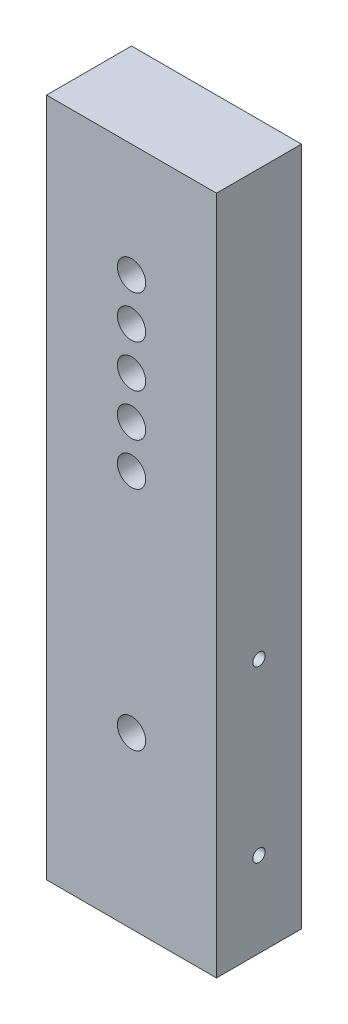
ISO-10303-21;
HEADER;
FILE_DESCRIPTION(('STEP AP214'),'2;1');
FILE_NAME('part.step','',(''),(''),'','','');
FILE_SCHEMA(('AUTOMOTIVE_DESIGN { 1 0 10303 214 1 1 1 1 }'));
ENDSEC;
DATA;
#1=APPLICATION_CONTEXT('core data for automotive mechanical design processes');
#2=APPLICATION_PROTOCOL_DEFINITION('international standard','automotive_design',2000,#1);
#3=PRODUCT_CONTEXT('',#1,'mechanical');
#4=PRODUCT('Part','Part','',(#3));
#5=PRODUCT_RELATED_PRODUCT_CATEGORY('part','',(#4));
#6=PRODUCT_DEFINITION_FORMATION('','',#4);
#7=PRODUCT_DEFINITION_CONTEXT('part definition',#1,'design');
#8=PRODUCT_DEFINITION('design','',#6,#7);
#9=PRODUCT_DEFINITION_SHAPE('','',#8);
#10=(LENGTH_UNIT() NAMED_UNIT(*) SI_UNIT(.MILLI.,.METRE.));
#11=(NAMED_UNIT(*) PLANE_ANGLE_UNIT() SI_UNIT($,.RADIAN.));
#12=(NAMED_UNIT(*) SI_UNIT($,.STERADIAN.) SOLID_ANGLE_UNIT());
#13=UNCERTAINTY_MEASURE_WITH_UNIT(LENGTH_MEASURE(1.E-05),#10,'distance_accuracy_value','');
#14=(GEOMETRIC_REPRESENTATION_CONTEXT(3) GLOBAL_UNCERTAINTY_ASSIGNED_CONTEXT((#13)) GLOBAL_UNIT_ASSIGNED_CONTEXT((#10,
#11,#12)) REPRESENTATION_CONTEXT('',''));
#15=CARTESIAN_POINT('',(0.,0.,0.));
#16=DIRECTION('',(0.,0.,1.));
#17=DIRECTION('',(1.,0.,0.));
#18=AXIS2_PLACEMENT_3D('',#15,#16,#17);
#19=CARTESIAN_POINT('',(50.927,114.3,412.75));
#20=DIRECTION('',(-1.,0.,0.));
#21=DIRECTION('',(0.,0.,1.));
#22=AXIS2_PLACEMENT_3D('',#19,#20,#21);
#23=PLANE('',#22);
#24=CARTESIAN_POINT('',(50.927,19.05,403.225));
#25=DIRECTION('',(-1.,0.,0.));
#26=DIRECTION('',(0.,0.,1.));
#27=AXIS2_PLACEMENT_3D('',#24,#25,#26);
#28=CIRCLE('',#27,1.38906250000009);
#29=CARTESIAN_POINT('',(50.927,19.05,404.6140625));
#30=VERTEX_POINT('',#29);
#31=EDGE_CURVE('E179',#30,#30,#28,.T.);
#32=ORIENTED_EDGE('',*,*,#31,.T.);
#33=EDGE_LOOP('',(#32));
#34=FACE_BOUND('',#33,.T.);
#35=CARTESIAN_POINT('',(50.927,-19.05,403.225));
#36=DIRECTION('',(-1.,0.,0.));
#37=DIRECTION('',(0.,0.,1.));
#38=AXIS2_PLACEMENT_3D('',#35,#36,#37);
#39=CIRCLE('',#38,1.38906250000009);
#40=CARTESIAN_POINT('',(50.927,-19.05,404.6140625));
#41=VERTEX_POINT('',#40);
#42=EDGE_CURVE('E173',#41,#41,#39,.T.);
#43=ORIENTED_EDGE('',*,*,#42,.T.);
#44=EDGE_LOOP('',(#43));
#45=FACE_BOUND('',#44,.T.);
#46=DIRECTION('',(0.,0.,-1.));
#47=VECTOR('',#46,1.);
#48=CARTESIAN_POINT('',(50.927,-38.1,412.75));
#49=LINE('',#48,#47);
#50=CARTESIAN_POINT('',(50.927,-38.1,412.75));
#51=VERTEX_POINT('',#50);
#52=CARTESIAN_POINT('',(50.927,-38.1,393.7));
#53=VERTEX_POINT('',#52);
#54=EDGE_CURVE('E109',#51,#53,#49,.T.);
#55=ORIENTED_EDGE('',*,*,#54,.T.);
#56=DIRECTION('',(0.,-1.,0.));
#57=VECTOR('',#56,1.);
#58=CARTESIAN_POINT('',(50.927,114.3,393.7));
#59=LINE('',#58,#57);
#60=CARTESIAN_POINT('',(50.927,114.3,393.7));
#61=VERTEX_POINT('',#60);
#62=EDGE_CURVE('E13',#61,#53,#59,.T.);
#63=ORIENTED_EDGE('',*,*,#62,.F.);
#64=DIRECTION('',(0.,0.,-1.));
#65=VECTOR('',#64,1.);
#66=CARTESIAN_POINT('',(50.927,114.3,412.75));
#67=LINE('',#66,#65);
#68=CARTESIAN_POINT('',(50.927,114.3,412.75));
#69=VERTEX_POINT('',#68);
#70=EDGE_CURVE('E97',#69,#61,#67,.T.);
#71=ORIENTED_EDGE('',*,*,#70,.F.);
#72=DIRECTION('',(0.,-1.,0.));
#73=VECTOR('',#72,1.);
#74=CARTESIAN_POINT('',(50.927,114.3,412.75));
#75=LINE('',#74,#73);
#76=EDGE_CURVE('E105',#69,#51,#75,.T.);
#77=ORIENTED_EDGE('',*,*,#76,.T.);
#78=EDGE_LOOP('',(#55,#63,#71,#77));
#79=FACE_BOUND('',#78,.T.);
#80=ADVANCED_FACE('F46',(#34,#45,#79),#23,.F.);
#81=CARTESIAN_POINT('',(50.927,114.3,393.7));
#82=DIRECTION('',(0.,0.,1.));
#83=DIRECTION('',(1.,0.,0.));
#84=AXIS2_PLACEMENT_3D('',#81,#82,#83);
#85=PLANE('',#84);
#86=CARTESIAN_POINT('',(31.877,79.375,393.7));
#87=DIRECTION('',(0.,0.,1.));
#88=DIRECTION('',(1.,0.,0.));
#89=AXIS2_PLACEMENT_3D('',#86,#87,#88);
#90=CIRCLE('',#89,3.175);
#91=CARTESIAN_POINT('',(35.052,79.375,393.7));
#92=VERTEX_POINT('',#91);
#93=EDGE_CURVE('E130',#92,#92,#90,.F.);
#94=ORIENTED_EDGE('',*,*,#93,.F.);
#95=EDGE_LOOP('',(#94));
#96=FACE_BOUND('',#95,.T.);
#97=CARTESIAN_POINT('',(31.877,69.85,393.7));
#98=DIRECTION('',(0.,0.,1.));
#99=DIRECTION('',(1.,0.,0.));
#100=AXIS2_PLACEMENT_3D('',#97,#98,#99);
#101=CIRCLE('',#100,3.175);
#102=CARTESIAN_POINT('',(35.052,69.85,393.7));
#103=VERTEX_POINT('',#102);
#104=EDGE_CURVE('E149',#103,#103,#101,.F.);
#105=ORIENTED_EDGE('',*,*,#104,.F.);
#106=EDGE_LOOP('',(#105));
#107=FACE_BOUND('',#106,.T.);
#108=CARTESIAN_POINT('',(31.877,60.325,393.7));
#109=DIRECTION('',(0.,0.,1.));
#110=DIRECTION('',(1.,0.,0.));
#111=AXIS2_PLACEMENT_3D('',#108,#109,#110);
#112=CIRCLE('',#111,3.175);
#113=CARTESIAN_POINT('',(35.052,60.325,393.7));
#114=VERTEX_POINT('',#113);
#115=EDGE_CURVE('E143',#114,#114,#112,.F.);
#116=ORIENTED_EDGE('',*,*,#115,.F.);
#117=EDGE_LOOP('',(#116));
#118=FACE_BOUND('',#117,.T.);
#119=CARTESIAN_POINT('',(31.877,50.8,393.7));
#120=DIRECTION('',(0.,0.,1.));
#121=DIRECTION('',(1.,0.,0.));
#122=AXIS2_PLACEMENT_3D('',#119,#120,#121);
#123=CIRCLE('',#122,3.175);
#124=CARTESIAN_POINT('',(35.052,50.8,393.7));
#125=VERTEX_POINT('',#124);
#126=EDGE_CURVE('E135',#125,#125,#123,.F.);
#127=ORIENTED_EDGE('',*,*,#126,.F.);
#128=EDGE_LOOP('',(#127));
#129=FACE_BOUND('',#128,.T.);
#130=CARTESIAN_POINT('',(31.877,0.,393.7));
#131=DIRECTION('',(0.,0.,1.));
#132=DIRECTION('',(1.,0.,0.));
#133=AXIS2_PLACEMENT_3D('',#130,#131,#132);
#134=CIRCLE('',#133,3.175);
#135=CARTESIAN_POINT('',(35.052,0.,393.7));
#136=VERTEX_POINT('',#135);
#137=EDGE_CURVE('E112',#136,#136,#134,.F.);
#138=ORIENTED_EDGE('',*,*,#137,.F.);
#139=EDGE_LOOP('',(#138));
#140=FACE_BOUND('',#139,.T.);
#141=CARTESIAN_POINT('',(31.877,88.9,393.7));
#142=DIRECTION('',(0.,0.,1.));
#143=DIRECTION('',(1.,0.,0.));
#144=AXIS2_PLACEMENT_3D('',#141,#142,#143);
#145=CIRCLE('',#144,3.175);
#146=CARTESIAN_POINT('',(35.052,88.9,393.7));
#147=VERTEX_POINT('',#146);
#148=EDGE_CURVE('E123',#147,#147,#145,.F.);
#149=ORIENTED_EDGE('',*,*,#148,.F.);
#150=EDGE_LOOP('',(#149));
#151=FACE_BOUND('',#150,.T.);
#152=DIRECTION('',(-1.,0.,0.));
#153=VECTOR('',#152,1.);
#154=CARTESIAN_POINT('',(50.927,-38.1,393.7));
#155=LINE('',#154,#153);
#156=CARTESIAN_POINT('',(12.827,-38.1,393.7));
#157=VERTEX_POINT('',#156);
#158=EDGE_CURVE('E101',#53,#157,#155,.T.);
#159=ORIENTED_EDGE('',*,*,#158,.T.);
#160=DIRECTION('',(0.,-1.,0.));
#161=VECTOR('',#160,1.);
#162=CARTESIAN_POINT('',(12.827,114.3,393.7));
#163=LINE('',#162,#161);
#164=CARTESIAN_POINT('',(12.827,114.3,393.7));
#165=VERTEX_POINT('',#164);
#166=EDGE_CURVE('E54',#165,#157,#163,.T.);
#167=ORIENTED_EDGE('',*,*,#166,.F.);
#168=DIRECTION('',(-1.,0.,0.));
#169=VECTOR('',#168,1.);
#170=CARTESIAN_POINT('',(50.927,114.3,393.7));
#171=LINE('',#170,#169);
#172=EDGE_CURVE('E92',#61,#165,#171,.T.);
#173=ORIENTED_EDGE('',*,*,#172,.F.);
#174=ORIENTED_EDGE('',*,*,#62,.T.);
#175=EDGE_LOOP('',(#159,#167,#173,#174));
#176=FACE_BOUND('',#175,.T.);
#177=ADVANCED_FACE('F100',(#96,#107,#118,#129,#140,#151,#176),#85,.F.);
#178=CARTESIAN_POINT('',(12.827,114.3,412.75));
#179=DIRECTION('',(1.,0.,0.));
#180=DIRECTION('',(0.,0.,-1.));
#181=AXIS2_PLACEMENT_3D('',#178,#179,#180);
#182=PLANE('',#181);
#183=CARTESIAN_POINT('',(12.827,-19.05,403.225));
#184=DIRECTION('',(-1.,0.,0.));
#185=DIRECTION('',(0.,0.,1.));
#186=AXIS2_PLACEMENT_3D('',#183,#184,#185);
#187=CIRCLE('',#186,1.38906250000009);
#188=CARTESIAN_POINT('',(12.827,-19.05,404.6140625));
#189=VERTEX_POINT('',#188);
#190=EDGE_CURVE('E166',#189,#189,#187,.T.);
#191=ORIENTED_EDGE('',*,*,#190,.F.);
#192=EDGE_LOOP('',(#191));
#193=FACE_BOUND('',#192,.T.);
#194=CARTESIAN_POINT('',(12.827,19.05,403.225));
#195=DIRECTION('',(-1.,0.,0.));
#196=DIRECTION('',(0.,0.,1.));
#197=AXIS2_PLACEMENT_3D('',#194,#195,#196);
#198=CIRCLE('',#197,1.38906250000009);
#199=CARTESIAN_POINT('',(12.827,19.05,404.6140625));
#200=VERTEX_POINT('',#199);
#201=EDGE_CURVE('E159',#200,#200,#198,.T.);
#202=ORIENTED_EDGE('',*,*,#201,.F.);
#203=EDGE_LOOP('',(#202));
#204=FACE_BOUND('',#203,.T.);
#205=DIRECTION('',(0.,0.,1.));
#206=VECTOR('',#205,1.);
#207=CARTESIAN_POINT('',(12.827,-38.1,412.75));
#208=LINE('',#207,#206);
#209=CARTESIAN_POINT('',(12.827,-38.1,412.75));
#210=VERTEX_POINT('',#209);
#211=EDGE_CURVE('E79',#157,#210,#208,.T.);
#212=ORIENTED_EDGE('',*,*,#211,.T.);
#213=DIRECTION('',(0.,-1.,0.));
#214=VECTOR('',#213,1.);
#215=CARTESIAN_POINT('',(12.827,114.3,412.75));
#216=LINE('',#215,#214);
#217=CARTESIAN_POINT('',(12.827,114.3,412.75));
#218=VERTEX_POINT('',#217);
#219=EDGE_CURVE('E102',#218,#210,#216,.T.);
#220=ORIENTED_EDGE('',*,*,#219,.F.);
#221=DIRECTION('',(0.,0.,1.));
#222=VECTOR('',#221,1.);
#223=CARTESIAN_POINT('',(12.827,114.3,412.75));
#224=LINE('',#223,#222);
#225=EDGE_CURVE('E95',#165,#218,#224,.T.);
#226=ORIENTED_EDGE('',*,*,#225,.F.);
#227=ORIENTED_EDGE('',*,*,#166,.T.);
#228=EDGE_LOOP('',(#212,#220,#226,#227));
#229=FACE_BOUND('',#228,.T.);
#230=ADVANCED_FACE('F103',(#193,#204,#229),#182,.F.);
#231=CARTESIAN_POINT('',(50.927,114.3,412.75));
#232=DIRECTION('',(0.,0.,-1.));
#233=DIRECTION('',(-1.,0.,0.));
#234=AXIS2_PLACEMENT_3D('',#231,#232,#233);
#235=PLANE('',#234);
#236=CARTESIAN_POINT('',(31.877,79.375,412.75));
#237=DIRECTION('',(0.,0.,1.));
#238=DIRECTION('',(1.,0.,0.));
#239=AXIS2_PLACEMENT_3D('',#236,#237,#238);
#240=CIRCLE('',#239,3.175);
#241=CARTESIAN_POINT('',(35.052,79.375,412.75));
#242=VERTEX_POINT('',#241);
#243=EDGE_CURVE('E152',#242,#242,#240,.T.);
#244=ORIENTED_EDGE('',*,*,#243,.F.);
#245=EDGE_LOOP('',(#244));
#246=FACE_BOUND('',#245,.T.);
#247=CARTESIAN_POINT('',(31.877,69.85,412.75));
#248=DIRECTION('',(0.,0.,1.));
#249=DIRECTION('',(1.,0.,0.));
#250=AXIS2_PLACEMENT_3D('',#247,#248,#249);
#251=CIRCLE('',#250,3.175);
#252=CARTESIAN_POINT('',(35.052,69.85,412.75));
#253=VERTEX_POINT('',#252);
#254=EDGE_CURVE('E146',#253,#253,#251,.T.);
#255=ORIENTED_EDGE('',*,*,#254,.F.);
#256=EDGE_LOOP('',(#255));
#257=FACE_BOUND('',#256,.T.);
#258=CARTESIAN_POINT('',(31.877,60.325,412.75));
#259=DIRECTION('',(0.,0.,1.));
#260=DIRECTION('',(1.,0.,0.));
#261=AXIS2_PLACEMENT_3D('',#258,#259,#260);
#262=CIRCLE('',#261,3.175);
#263=CARTESIAN_POINT('',(35.052,60.325,412.75));
#264=VERTEX_POINT('',#263);
#265=EDGE_CURVE('E138',#264,#264,#262,.T.);
#266=ORIENTED_EDGE('',*,*,#265,.F.);
#267=EDGE_LOOP('',(#266));
#268=FACE_BOUND('',#267,.T.);
#269=CARTESIAN_POINT('',(31.877,50.8,412.75));
#270=DIRECTION('',(0.,0.,1.));
#271=DIRECTION('',(1.,0.,0.));
#272=AXIS2_PLACEMENT_3D('',#269,#270,#271);
#273=CIRCLE('',#272,3.175);
#274=CARTESIAN_POINT('',(35.052,50.8,412.75));
#275=VERTEX_POINT('',#274);
#276=EDGE_CURVE('E139',#275,#275,#273,.T.);
#277=ORIENTED_EDGE('',*,*,#276,.F.);
#278=EDGE_LOOP('',(#277));
#279=FACE_BOUND('',#278,.T.);
#280=CARTESIAN_POINT('',(31.877,0.,412.75));
#281=DIRECTION('',(0.,0.,1.));
#282=DIRECTION('',(1.,0.,0.));
#283=AXIS2_PLACEMENT_3D('',#280,#281,#282);
#284=CIRCLE('',#283,3.175);
#285=CARTESIAN_POINT('',(35.052,0.,412.75));
#286=VERTEX_POINT('',#285);
#287=EDGE_CURVE('E126',#286,#286,#284,.T.);
#288=ORIENTED_EDGE('',*,*,#287,.F.);
#289=EDGE_LOOP('',(#288));
#290=FACE_BOUND('',#289,.T.);
#291=CARTESIAN_POINT('',(31.877,88.9,412.75));
#292=DIRECTION('',(0.,0.,1.));
#293=DIRECTION('',(1.,0.,0.));
#294=AXIS2_PLACEMENT_3D('',#291,#292,#293);
#295=CIRCLE('',#294,3.175);
#296=CARTESIAN_POINT('',(35.052,88.9,412.75));
#297=VERTEX_POINT('',#296);
#298=EDGE_CURVE('E127',#297,#297,#295,.T.);
#299=ORIENTED_EDGE('',*,*,#298,.F.);
#300=EDGE_LOOP('',(#299));
#301=FACE_BOUND('',#300,.T.);
#302=DIRECTION('',(1.,0.,0.));
#303=VECTOR('',#302,1.);
#304=CARTESIAN_POINT('',(50.927,-38.1,412.75));
#305=LINE('',#304,#303);
#306=EDGE_CURVE('E85',#210,#51,#305,.T.);
#307=ORIENTED_EDGE('',*,*,#306,.T.);
#308=ORIENTED_EDGE('',*,*,#76,.F.);
#309=DIRECTION('',(1.,0.,0.));
#310=VECTOR('',#309,1.);
#311=CARTESIAN_POINT('',(50.927,114.3,412.75));
#312=LINE('',#311,#310);
#313=EDGE_CURVE('E62',#218,#69,#312,.T.);
#314=ORIENTED_EDGE('',*,*,#313,.F.);
#315=ORIENTED_EDGE('',*,*,#219,.T.);
#316=EDGE_LOOP('',(#307,#308,#314,#315));
#317=FACE_BOUND('',#316,.T.);
#318=ADVANCED_FACE('F117',(#246,#257,#268,#279,#290,#301,#317),#235,.F.);
#319=CARTESIAN_POINT('',(0.,114.3,0.));
#320=DIRECTION('',(0.,1.,0.));
#321=DIRECTION('',(0.,0.,1.));
#322=AXIS2_PLACEMENT_3D('',#319,#320,#321);
#323=PLANE('',#322);
#324=ORIENTED_EDGE('',*,*,#70,.T.);
#325=ORIENTED_EDGE('',*,*,#172,.T.);
#326=ORIENTED_EDGE('',*,*,#225,.T.);
#327=ORIENTED_EDGE('',*,*,#313,.T.);
#328=EDGE_LOOP('',(#324,#325,#326,#327));
#329=FACE_BOUND('',#328,.T.);
#330=ADVANCED_FACE('F93',(#329),#323,.T.);
#331=CARTESIAN_POINT('',(0.,-38.1,0.));
#332=DIRECTION('',(0.,1.,0.));
#333=DIRECTION('',(0.,0.,1.));
#334=AXIS2_PLACEMENT_3D('',#331,#332,#333);
#335=PLANE('',#334);
#336=ORIENTED_EDGE('',*,*,#54,.F.);
#337=ORIENTED_EDGE('',*,*,#306,.F.);
#338=ORIENTED_EDGE('',*,*,#211,.F.);
#339=ORIENTED_EDGE('',*,*,#158,.F.);
#340=EDGE_LOOP('',(#336,#337,#338,#339));
#341=FACE_BOUND('',#340,.T.);
#342=ADVANCED_FACE('F120',(#341),#335,.F.);
#343=CARTESIAN_POINT('',(31.877,88.9,-127.001));
#344=DIRECTION('',(0.,0.,1.));
#345=DIRECTION('',(1.,0.,0.));
#346=AXIS2_PLACEMENT_3D('',#343,#344,#345);
#347=CYLINDRICAL_SURFACE('',#346,3.175);
#348=ORIENTED_EDGE('',*,*,#298,.T.);
#349=EDGE_LOOP('',(#348));
#350=FACE_BOUND('',#349,.T.);
#351=ORIENTED_EDGE('',*,*,#148,.T.);
#352=EDGE_LOOP('',(#351));
#353=FACE_BOUND('',#352,.T.);
#354=ADVANCED_FACE('F218',(#350,#353),#347,.F.);
#355=CARTESIAN_POINT('',(31.877,0.,-127.001));
#356=DIRECTION('',(0.,0.,1.));
#357=DIRECTION('',(1.,0.,0.));
#358=AXIS2_PLACEMENT_3D('',#355,#356,#357);
#359=CYLINDRICAL_SURFACE('',#358,3.175);
#360=ORIENTED_EDGE('',*,*,#287,.T.);
#361=EDGE_LOOP('',(#360));
#362=FACE_BOUND('',#361,.T.);
#363=ORIENTED_EDGE('',*,*,#137,.T.);
#364=EDGE_LOOP('',(#363));
#365=FACE_BOUND('',#364,.T.);
#366=ADVANCED_FACE('F223',(#362,#365),#359,.F.);
#367=CARTESIAN_POINT('',(31.877,50.8,-127.001));
#368=DIRECTION('',(0.,0.,1.));
#369=DIRECTION('',(1.,0.,0.));
#370=AXIS2_PLACEMENT_3D('',#367,#368,#369);
#371=CYLINDRICAL_SURFACE('',#370,3.175);
#372=ORIENTED_EDGE('',*,*,#276,.T.);
#373=EDGE_LOOP('',(#372));
#374=FACE_BOUND('',#373,.T.);
#375=ORIENTED_EDGE('',*,*,#126,.T.);
#376=EDGE_LOOP('',(#375));
#377=FACE_BOUND('',#376,.T.);
#378=ADVANCED_FACE('F227',(#374,#377),#371,.F.);
#379=CARTESIAN_POINT('',(31.877,60.325,-127.001));
#380=DIRECTION('',(0.,0.,1.));
#381=DIRECTION('',(1.,0.,0.));
#382=AXIS2_PLACEMENT_3D('',#379,#380,#381);
#383=CYLINDRICAL_SURFACE('',#382,3.175);
#384=ORIENTED_EDGE('',*,*,#265,.T.);
#385=EDGE_LOOP('',(#384));
#386=FACE_BOUND('',#385,.T.);
#387=ORIENTED_EDGE('',*,*,#115,.T.);
#388=EDGE_LOOP('',(#387));
#389=FACE_BOUND('',#388,.T.);
#390=ADVANCED_FACE('F231',(#386,#389),#383,.F.);
#391=CARTESIAN_POINT('',(31.877,69.85,-127.001));
#392=DIRECTION('',(0.,0.,1.));
#393=DIRECTION('',(1.,0.,0.));
#394=AXIS2_PLACEMENT_3D('',#391,#392,#393);
#395=CYLINDRICAL_SURFACE('',#394,3.175);
#396=ORIENTED_EDGE('',*,*,#254,.T.);
#397=EDGE_LOOP('',(#396));
#398=FACE_BOUND('',#397,.T.);
#399=ORIENTED_EDGE('',*,*,#104,.T.);
#400=EDGE_LOOP('',(#399));
#401=FACE_BOUND('',#400,.T.);
#402=ADVANCED_FACE('F235',(#398,#401),#395,.F.);
#403=CARTESIAN_POINT('',(31.877,79.375,-127.001));
#404=DIRECTION('',(0.,0.,1.));
#405=DIRECTION('',(1.,0.,0.));
#406=AXIS2_PLACEMENT_3D('',#403,#404,#405);
#407=CYLINDRICAL_SURFACE('',#406,3.175);
#408=ORIENTED_EDGE('',*,*,#243,.T.);
#409=EDGE_LOOP('',(#408));
#410=FACE_BOUND('',#409,.T.);
#411=ORIENTED_EDGE('',*,*,#93,.T.);
#412=EDGE_LOOP('',(#411));
#413=FACE_BOUND('',#412,.T.);
#414=ADVANCED_FACE('F239',(#410,#413),#407,.F.);
#415=CARTESIAN_POINT('',(25.527,19.05,403.225));
#416=DIRECTION('',(-1.,0.,0.));
#417=DIRECTION('',(0.,0.,1.));
#418=AXIS2_PLACEMENT_3D('',#415,#416,#417);
#419=CYLINDRICAL_SURFACE('',#418,1.38906250000009);
#420=CARTESIAN_POINT('',(25.527,19.05,403.225));
#421=DIRECTION('',(-1.,0.,0.));
#422=DIRECTION('',(0.,0.,1.));
#423=AXIS2_PLACEMENT_3D('',#420,#421,#422);
#424=CIRCLE('',#423,1.38906250000009);
#425=CARTESIAN_POINT('',(25.527,19.05,404.6140625));
#426=VERTEX_POINT('',#425);
#427=EDGE_CURVE('E162',#426,#426,#424,.T.);
#428=ORIENTED_EDGE('',*,*,#427,.F.);
#429=EDGE_LOOP('',(#428));
#430=FACE_BOUND('',#429,.T.);
#431=ORIENTED_EDGE('',*,*,#201,.T.);
#432=EDGE_LOOP('',(#431));
#433=FACE_BOUND('',#432,.T.);
#434=ADVANCED_FACE('F243',(#430,#433),#419,.F.);
#435=CARTESIAN_POINT('',(25.527,19.05,403.225));
#436=DIRECTION('',(-1.,0.,0.));
#437=DIRECTION('',(0.,0.,1.));
#438=AXIS2_PLACEMENT_3D('',#435,#436,#437);
#439=PLANE('',#438);
#440=ORIENTED_EDGE('',*,*,#427,.T.);
#441=EDGE_LOOP('',(#440));
#442=FACE_BOUND('',#441,.T.);
#443=ADVANCED_FACE('F247',(#442),#439,.T.);
#444=CARTESIAN_POINT('',(25.527,-19.05,403.225));
#445=DIRECTION('',(-1.,0.,0.));
#446=DIRECTION('',(0.,0.,1.));
#447=AXIS2_PLACEMENT_3D('',#444,#445,#446);
#448=CYLINDRICAL_SURFACE('',#447,1.38906250000009);
#449=CARTESIAN_POINT('',(25.527,-19.05,403.225));
#450=DIRECTION('',(-1.,0.,0.));
#451=DIRECTION('',(0.,0.,1.));
#452=AXIS2_PLACEMENT_3D('',#449,#450,#451);
#453=CIRCLE('',#452,1.38906250000009);
#454=CARTESIAN_POINT('',(25.527,-19.05,404.6140625));
#455=VERTEX_POINT('',#454);
#456=EDGE_CURVE('E142',#455,#455,#453,.T.);
#457=ORIENTED_EDGE('',*,*,#456,.F.);
#458=EDGE_LOOP('',(#457));
#459=FACE_BOUND('',#458,.T.);
#460=ORIENTED_EDGE('',*,*,#190,.T.);
#461=EDGE_LOOP('',(#460));
#462=FACE_BOUND('',#461,.T.);
#463=ADVANCED_FACE('F251',(#459,#462),#448,.F.);
#464=CARTESIAN_POINT('',(25.527,-19.05,403.225));
#465=DIRECTION('',(-1.,0.,0.));
#466=DIRECTION('',(0.,0.,1.));
#467=AXIS2_PLACEMENT_3D('',#464,#465,#466);
#468=PLANE('',#467);
#469=ORIENTED_EDGE('',*,*,#456,.T.);
#470=EDGE_LOOP('',(#469));
#471=FACE_BOUND('',#470,.T.);
#472=ADVANCED_FACE('F255',(#471),#468,.T.);
#473=CARTESIAN_POINT('',(38.227,-19.05,403.225));
#474=DIRECTION('',(1.,0.,0.));
#475=DIRECTION('',(0.,0.,1.));
#476=AXIS2_PLACEMENT_3D('',#473,#474,#475);
#477=CYLINDRICAL_SURFACE('',#476,1.38906250000009);
#478=CARTESIAN_POINT('',(38.227,-19.05,403.225));
#479=DIRECTION('',(-1.,0.,0.));
#480=DIRECTION('',(0.,0.,1.));
#481=AXIS2_PLACEMENT_3D('',#478,#479,#480);
#482=CIRCLE('',#481,1.38906250000009);
#483=CARTESIAN_POINT('',(38.227,-19.05,404.6140625));
#484=VERTEX_POINT('',#483);
#485=EDGE_CURVE('E163',#484,#484,#482,.T.);
#486=ORIENTED_EDGE('',*,*,#485,.T.);
#487=EDGE_LOOP('',(#486));
#488=FACE_BOUND('',#487,.T.);
#489=ORIENTED_EDGE('',*,*,#42,.F.);
#490=EDGE_LOOP('',(#489));
#491=FACE_BOUND('',#490,.T.);
#492=ADVANCED_FACE('F197',(#488,#491),#477,.F.);
#493=CARTESIAN_POINT('',(38.227,-19.05,403.225));
#494=DIRECTION('',(1.,0.,0.));
#495=DIRECTION('',(0.,0.,1.));
#496=AXIS2_PLACEMENT_3D('',#493,#494,#495);
#497=PLANE('',#496);
#498=ORIENTED_EDGE('',*,*,#485,.F.);
#499=EDGE_LOOP('',(#498));
#500=FACE_BOUND('',#499,.T.);
#501=ADVANCED_FACE('F188',(#500),#497,.T.);
#502=CARTESIAN_POINT('',(38.227,19.05,403.225));
#503=DIRECTION('',(1.,0.,0.));
#504=DIRECTION('',(0.,0.,1.));
#505=AXIS2_PLACEMENT_3D('',#502,#503,#504);
#506=CYLINDRICAL_SURFACE('',#505,1.38906250000009);
#507=CARTESIAN_POINT('',(38.227,19.05,403.225));
#508=DIRECTION('',(-1.,0.,0.));
#509=DIRECTION('',(0.,0.,1.));
#510=AXIS2_PLACEMENT_3D('',#507,#508,#509);
#511=CIRCLE('',#510,1.38906250000009);
#512=CARTESIAN_POINT('',(38.227,19.05,404.6140625));
#513=VERTEX_POINT('',#512);
#514=EDGE_CURVE('E176',#513,#513,#511,.T.);
#515=ORIENTED_EDGE('',*,*,#514,.T.);
#516=EDGE_LOOP('',(#515));
#517=FACE_BOUND('',#516,.T.);
#518=ORIENTED_EDGE('',*,*,#31,.F.);
#519=EDGE_LOOP('',(#518));
#520=FACE_BOUND('',#519,.T.);
#521=ADVANCED_FACE('F185',(#517,#520),#506,.F.);
#522=CARTESIAN_POINT('',(38.227,19.05,403.225));
#523=DIRECTION('',(1.,0.,0.));
#524=DIRECTION('',(0.,0.,1.));
#525=AXIS2_PLACEMENT_3D('',#522,#523,#524);
#526=PLANE('',#525);
#527=ORIENTED_EDGE('',*,*,#514,.F.);
#528=EDGE_LOOP('',(#527));
#529=FACE_BOUND('',#528,.T.);
#530=ADVANCED_FACE('F187',(#529),#526,.T.);
#531=CLOSED_SHELL('',(#80,#177,#230,#318,#330,#342,#354,#366,#378,#390,#402,#414,#434,#443,#463,
#472,#492,#501,#521,#530));
#532=MANIFOLD_SOLID_BREP('B2',#531);
#533=ADVANCED_BREP_SHAPE_REPRESENTATION('',(#18,#532),#14);
#534=SHAPE_DEFINITION_REPRESENTATION(#9,#533);
ENDSEC;
END-ISO-10303-21;
